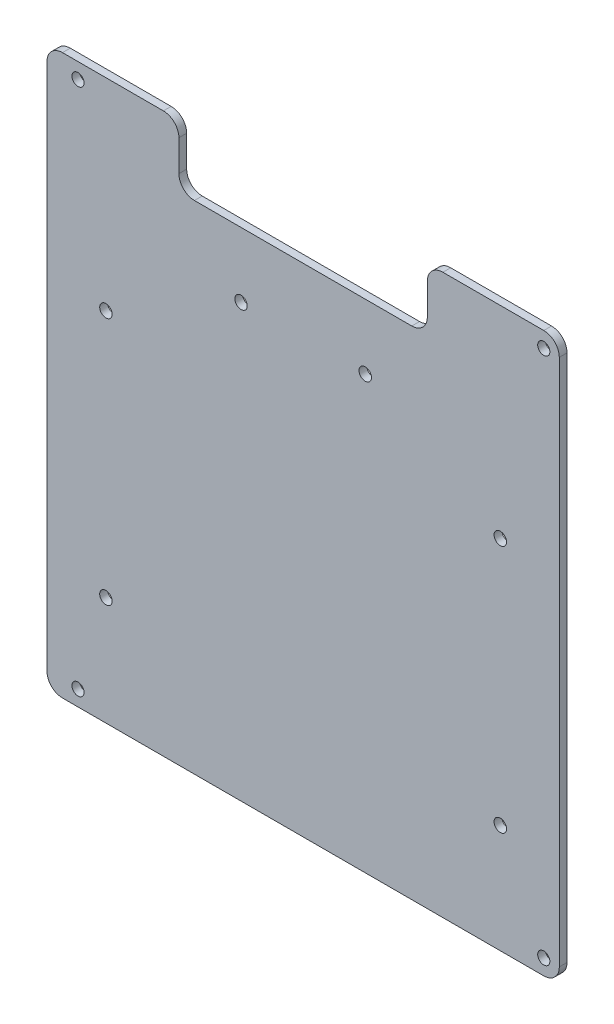
ISO-10303-21;
HEADER;
FILE_DESCRIPTION(('STEP AP214'),'2;1');
FILE_NAME('part.step','',(''),(''),'','','');
FILE_SCHEMA(('AUTOMOTIVE_DESIGN { 1 0 10303 214 1 1 1 1 }'));
ENDSEC;
DATA;
#1=APPLICATION_CONTEXT('core data for automotive mechanical design processes');
#2=APPLICATION_PROTOCOL_DEFINITION('international standard','automotive_design',2000,#1);
#3=PRODUCT_CONTEXT('',#1,'mechanical');
#4=PRODUCT('Part','Part','',(#3));
#5=PRODUCT_RELATED_PRODUCT_CATEGORY('part','',(#4));
#6=PRODUCT_DEFINITION_FORMATION('','',#4);
#7=PRODUCT_DEFINITION_CONTEXT('part definition',#1,'design');
#8=PRODUCT_DEFINITION('design','',#6,#7);
#9=PRODUCT_DEFINITION_SHAPE('','',#8);
#10=(LENGTH_UNIT() NAMED_UNIT(*) SI_UNIT(.MILLI.,.METRE.));
#11=(NAMED_UNIT(*) PLANE_ANGLE_UNIT() SI_UNIT($,.RADIAN.));
#12=(NAMED_UNIT(*) SI_UNIT($,.STERADIAN.) SOLID_ANGLE_UNIT());
#13=UNCERTAINTY_MEASURE_WITH_UNIT(LENGTH_MEASURE(1.E-05),#10,'distance_accuracy_value','');
#14=(GEOMETRIC_REPRESENTATION_CONTEXT(3) GLOBAL_UNCERTAINTY_ASSIGNED_CONTEXT((#13)) GLOBAL_UNIT_ASSIGNED_CONTEXT((#10,
#11,#12)) REPRESENTATION_CONTEXT('',''));
#15=CARTESIAN_POINT('',(0.,0.,0.));
#16=DIRECTION('',(0.,0.,1.));
#17=DIRECTION('',(1.,0.,0.));
#18=AXIS2_PLACEMENT_3D('',#15,#16,#17);
#19=CARTESIAN_POINT('',(-47.625,-107.95,149.225));
#20=DIRECTION('',(0.,-1.,0.));
#21=DIRECTION('',(0.,0.,-1.));
#22=AXIS2_PLACEMENT_3D('',#19,#20,#21);
#23=PLANE('',#22);
#24=DIRECTION('',(1.,0.,0.));
#25=VECTOR('',#24,1.);
#26=CARTESIAN_POINT('',(-47.625,-107.95,152.4));
#27=LINE('',#26,#25);
#28=CARTESIAN_POINT('',(-146.05,-107.95,152.4));
#29=VERTEX_POINT('',#28);
#30=CARTESIAN_POINT('',(-104.775,-107.95,152.4));
#31=VERTEX_POINT('',#30);
#32=EDGE_CURVE('E334',#29,#31,#27,.T.);
#33=ORIENTED_EDGE('',*,*,#32,.T.);
#34=DIRECTION('',(0.,0.,1.));
#35=VECTOR('',#34,1.);
#36=CARTESIAN_POINT('',(-104.775,-107.95,149.225));
#37=LINE('',#36,#35);
#38=CARTESIAN_POINT('',(-104.775,-107.95,149.225));
#39=VERTEX_POINT('',#38);
#40=EDGE_CURVE('E26',#31,#39,#37,.F.);
#41=ORIENTED_EDGE('',*,*,#40,.T.);
#42=DIRECTION('',(1.,0.,0.));
#43=VECTOR('',#42,1.);
#44=CARTESIAN_POINT('',(-47.625,-107.95,149.225));
#45=LINE('',#44,#43);
#46=CARTESIAN_POINT('',(-146.05,-107.95,149.225));
#47=VERTEX_POINT('',#46);
#48=EDGE_CURVE('E314',#47,#39,#45,.T.);
#49=ORIENTED_EDGE('',*,*,#48,.F.);
#50=DIRECTION('',(0.,0.,1.));
#51=VECTOR('',#50,1.);
#52=CARTESIAN_POINT('',(-146.05,-107.95,149.225));
#53=LINE('',#52,#51);
#54=EDGE_CURVE('E178',#47,#29,#53,.T.);
#55=ORIENTED_EDGE('',*,*,#54,.T.);
#56=EDGE_LOOP('',(#33,#41,#49,#55));
#57=FACE_BOUND('',#56,.T.);
#58=ADVANCED_FACE('F17',(#57),#23,.F.);
#59=CARTESIAN_POINT('',(0.,-219.075,149.225));
#60=DIRECTION('',(0.,0.,1.));
#61=DIRECTION('',(1.,0.,0.));
#62=AXIS2_PLACEMENT_3D('',#59,#60,#61);
#63=PLANE('',#62);
#64=CARTESIAN_POINT('',(-22.225,-159.893,149.225));
#65=DIRECTION('',(0.,0.,-1.));
#66=DIRECTION('',(-1.,0.,0.));
#67=AXIS2_PLACEMENT_3D('',#64,#65,#66);
#68=CIRCLE('',#67,2.5527);
#69=CARTESIAN_POINT('',(-24.7777,-159.893,149.225));
#70=VERTEX_POINT('',#69);
#71=EDGE_CURVE('E302',#70,#70,#68,.T.);
#72=ORIENTED_EDGE('',*,*,#71,.F.);
#73=EDGE_LOOP('',(#72));
#74=FACE_BOUND('',#73,.T.);
#75=CARTESIAN_POINT('',(-128.27,-190.5,149.225));
#76=DIRECTION('',(0.,0.,-1.));
#77=DIRECTION('',(-1.,0.,0.));
#78=AXIS2_PLACEMENT_3D('',#75,#76,#77);
#79=CIRCLE('',#78,2.5527);
#80=CARTESIAN_POINT('',(-130.8227,-190.5,149.225));
#81=VERTEX_POINT('',#80);
#82=EDGE_CURVE('E305',#81,#81,#79,.T.);
#83=ORIENTED_EDGE('',*,*,#82,.F.);
#84=EDGE_LOOP('',(#83));
#85=FACE_BOUND('',#84,.T.);
#86=CARTESIAN_POINT('',(-128.27,-292.1,149.225));
#87=DIRECTION('',(0.,0.,-1.));
#88=DIRECTION('',(-1.,0.,0.));
#89=AXIS2_PLACEMENT_3D('',#86,#87,#88);
#90=CIRCLE('',#89,2.5527);
#91=CARTESIAN_POINT('',(-130.8227,-292.1,149.225));
#92=VERTEX_POINT('',#91);
#93=EDGE_CURVE('E338',#92,#92,#90,.T.);
#94=ORIENTED_EDGE('',*,*,#93,.F.);
#95=EDGE_LOOP('',(#94));
#96=FACE_BOUND('',#95,.T.);
#97=CARTESIAN_POINT('',(33.02,-190.5,149.225));
#98=DIRECTION('',(0.,0.,-1.));
#99=DIRECTION('',(-1.,0.,0.));
#100=AXIS2_PLACEMENT_3D('',#97,#98,#99);
#101=CIRCLE('',#100,2.5527);
#102=CARTESIAN_POINT('',(30.4673,-190.5,149.225));
#103=VERTEX_POINT('',#102);
#104=EDGE_CURVE('E340',#103,#103,#101,.T.);
#105=ORIENTED_EDGE('',*,*,#104,.F.);
#106=EDGE_LOOP('',(#105));
#107=FACE_BOUND('',#106,.T.);
#108=CARTESIAN_POINT('',(33.02,-292.1,149.225));
#109=DIRECTION('',(0.,0.,-1.));
#110=DIRECTION('',(-1.,0.,0.));
#111=AXIS2_PLACEMENT_3D('',#108,#109,#110);
#112=CIRCLE('',#111,2.5527);
#113=CARTESIAN_POINT('',(30.4673,-292.1,149.225));
#114=VERTEX_POINT('',#113);
#115=EDGE_CURVE('E225',#114,#114,#112,.T.);
#116=ORIENTED_EDGE('',*,*,#115,.F.);
#117=EDGE_LOOP('',(#116));
#118=FACE_BOUND('',#117,.T.);
#119=ORIENTED_EDGE('',*,*,#48,.T.);
#120=CARTESIAN_POINT('',(-104.775,-114.3,149.225));
#121=DIRECTION('',(0.,0.,1.));
#122=DIRECTION('',(1.,0.,0.));
#123=AXIS2_PLACEMENT_3D('',#120,#121,#122);
#124=CIRCLE('',#123,6.35);
#125=CARTESIAN_POINT('',(-98.425,-114.3,149.225));
#126=VERTEX_POINT('',#125);
#127=EDGE_CURVE('E11',#39,#126,#124,.F.);
#128=ORIENTED_EDGE('',*,*,#127,.T.);
#129=DIRECTION('',(0.,-1.,0.));
#130=VECTOR('',#129,1.);
#131=CARTESIAN_POINT('',(-98.425,-219.075,149.225));
#132=LINE('',#131,#130);
#133=CARTESIAN_POINT('',(-98.425,-127.,149.225));
#134=VERTEX_POINT('',#133);
#135=EDGE_CURVE('E248',#126,#134,#132,.T.);
#136=ORIENTED_EDGE('',*,*,#135,.T.);
#137=CARTESIAN_POINT('',(-92.075,-127.,149.225));
#138=DIRECTION('',(0.,0.,1.));
#139=DIRECTION('',(1.,0.,0.));
#140=AXIS2_PLACEMENT_3D('',#137,#138,#139);
#141=CIRCLE('',#140,6.35);
#142=CARTESIAN_POINT('',(-92.075,-133.35,149.225));
#143=VERTEX_POINT('',#142);
#144=EDGE_CURVE('E278',#134,#143,#141,.T.);
#145=ORIENTED_EDGE('',*,*,#144,.T.);
#146=DIRECTION('',(1.,0.,0.));
#147=VECTOR('',#146,1.);
#148=CARTESIAN_POINT('',(0.,-133.35,149.225));
#149=LINE('',#148,#147);
#150=CARTESIAN_POINT('',(-3.17500000000014,-133.35,149.225));
#151=VERTEX_POINT('',#150);
#152=EDGE_CURVE('E323',#143,#151,#149,.T.);
#153=ORIENTED_EDGE('',*,*,#152,.T.);
#154=CARTESIAN_POINT('',(-3.17500000000014,-127.,149.225));
#155=DIRECTION('',(0.,0.,1.));
#156=DIRECTION('',(1.,0.,0.));
#157=AXIS2_PLACEMENT_3D('',#154,#155,#156);
#158=CIRCLE('',#157,6.35);
#159=CARTESIAN_POINT('',(3.17499999999986,-127.,149.225));
#160=VERTEX_POINT('',#159);
#161=EDGE_CURVE('E263',#151,#160,#158,.T.);
#162=ORIENTED_EDGE('',*,*,#161,.T.);
#163=DIRECTION('',(0.,-1.,0.));
#164=VECTOR('',#163,1.);
#165=CARTESIAN_POINT('',(3.17499999999985,-219.075,149.225));
#166=LINE('',#165,#164);
#167=CARTESIAN_POINT('',(3.17499999999986,-114.3,149.225));
#168=VERTEX_POINT('',#167);
#169=EDGE_CURVE('E219',#168,#160,#166,.T.);
#170=ORIENTED_EDGE('',*,*,#169,.F.);
#171=CARTESIAN_POINT('',(9.52499999999987,-114.3,149.225));
#172=DIRECTION('',(0.,0.,1.));
#173=DIRECTION('',(1.,0.,0.));
#174=AXIS2_PLACEMENT_3D('',#171,#172,#173);
#175=CIRCLE('',#174,6.35);
#176=CARTESIAN_POINT('',(9.52499999999987,-107.95,149.225));
#177=VERTEX_POINT('',#176);
#178=EDGE_CURVE('E291',#168,#177,#175,.F.);
#179=ORIENTED_EDGE('',*,*,#178,.T.);
#180=CARTESIAN_POINT('',(50.8,-107.95,149.225));
#181=VERTEX_POINT('',#180);
#182=EDGE_CURVE('E312',#177,#181,#45,.T.);
#183=ORIENTED_EDGE('',*,*,#182,.T.);
#184=CARTESIAN_POINT('',(50.8,-114.3,149.225));
#185=DIRECTION('',(0.,0.,1.));
#186=DIRECTION('',(1.,0.,0.));
#187=AXIS2_PLACEMENT_3D('',#184,#185,#186);
#188=CIRCLE('',#187,6.35);
#189=CARTESIAN_POINT('',(57.15,-114.3,149.225));
#190=VERTEX_POINT('',#189);
#191=EDGE_CURVE('E175',#181,#190,#188,.F.);
#192=ORIENTED_EDGE('',*,*,#191,.T.);
#193=DIRECTION('',(0.,1.,0.));
#194=VECTOR('',#193,1.);
#195=CARTESIAN_POINT('',(57.15,-222.25,149.225));
#196=LINE('',#195,#194);
#197=CARTESIAN_POINT('',(57.15,-330.2,149.225));
#198=VERTEX_POINT('',#197);
#199=EDGE_CURVE('E157',#198,#190,#196,.T.);
#200=ORIENTED_EDGE('',*,*,#199,.F.);
#201=CARTESIAN_POINT('',(50.8,-330.2,149.225));
#202=DIRECTION('',(0.,0.,1.));
#203=DIRECTION('',(1.,0.,0.));
#204=AXIS2_PLACEMENT_3D('',#201,#202,#203);
#205=CIRCLE('',#204,6.35);
#206=CARTESIAN_POINT('',(50.8,-336.55,149.225));
#207=VERTEX_POINT('',#206);
#208=EDGE_CURVE('E202',#198,#207,#205,.F.);
#209=ORIENTED_EDGE('',*,*,#208,.T.);
#210=DIRECTION('',(1.,0.,0.));
#211=VECTOR('',#210,1.);
#212=CARTESIAN_POINT('',(-47.625,-336.55,149.225));
#213=LINE('',#212,#211);
#214=CARTESIAN_POINT('',(-146.05,-336.55,149.225));
#215=VERTEX_POINT('',#214);
#216=EDGE_CURVE('E309',#215,#207,#213,.T.);
#217=ORIENTED_EDGE('',*,*,#216,.F.);
#218=CARTESIAN_POINT('',(-146.05,-330.2,149.225));
#219=DIRECTION('',(0.,0.,1.));
#220=DIRECTION('',(1.,0.,0.));
#221=AXIS2_PLACEMENT_3D('',#218,#219,#220);
#222=CIRCLE('',#221,6.35);
#223=CARTESIAN_POINT('',(-152.4,-330.2,149.225));
#224=VERTEX_POINT('',#223);
#225=EDGE_CURVE('E216',#215,#224,#222,.F.);
#226=ORIENTED_EDGE('',*,*,#225,.T.);
#227=DIRECTION('',(0.,1.,0.));
#228=VECTOR('',#227,1.);
#229=CARTESIAN_POINT('',(-152.4,-222.25,149.225));
#230=LINE('',#229,#228);
#231=CARTESIAN_POINT('',(-152.4,-114.3,149.225));
#232=VERTEX_POINT('',#231);
#233=EDGE_CURVE('E332',#224,#232,#230,.T.);
#234=ORIENTED_EDGE('',*,*,#233,.T.);
#235=CARTESIAN_POINT('',(-146.05,-114.3,149.225));
#236=DIRECTION('',(0.,0.,1.));
#237=DIRECTION('',(1.,0.,0.));
#238=AXIS2_PLACEMENT_3D('',#235,#236,#237);
#239=CIRCLE('',#238,6.35);
#240=EDGE_CURVE('E190',#232,#47,#239,.F.);
#241=ORIENTED_EDGE('',*,*,#240,.T.);
#242=EDGE_LOOP('',(#119,#128,#136,#145,#153,#162,#170,#179,#183,#192,#200,#209,#217,#226,#234,#241));
#243=FACE_BOUND('',#242,.T.);
#244=CARTESIAN_POINT('',(-139.7,-330.2,149.225));
#245=DIRECTION('',(0.,0.,1.));
#246=DIRECTION('',(1.,0.,0.));
#247=AXIS2_PLACEMENT_3D('',#244,#245,#246);
#248=CIRCLE('',#247,2.4892);
#249=CARTESIAN_POINT('',(-137.2108,-330.2,149.225));
#250=VERTEX_POINT('',#249);
#251=EDGE_CURVE('E308',#250,#250,#248,.T.);
#252=ORIENTED_EDGE('',*,*,#251,.T.);
#253=EDGE_LOOP('',(#252));
#254=FACE_BOUND('',#253,.T.);
#255=CARTESIAN_POINT('',(50.8,-330.2,149.225));
#256=DIRECTION('',(0.,0.,1.));
#257=DIRECTION('',(1.,0.,0.));
#258=AXIS2_PLACEMENT_3D('',#255,#256,#257);
#259=CIRCLE('',#258,2.4892);
#260=CARTESIAN_POINT('',(53.2892,-330.2,149.225));
#261=VERTEX_POINT('',#260);
#262=EDGE_CURVE('E315',#261,#261,#259,.T.);
#263=ORIENTED_EDGE('',*,*,#262,.T.);
#264=EDGE_LOOP('',(#263));
#265=FACE_BOUND('',#264,.T.);
#266=CARTESIAN_POINT('',(-139.7,-114.3,149.225));
#267=DIRECTION('',(0.,0.,1.));
#268=DIRECTION('',(1.,0.,0.));
#269=AXIS2_PLACEMENT_3D('',#266,#267,#268);
#270=CIRCLE('',#269,2.4892);
#271=CARTESIAN_POINT('',(-137.2108,-114.3,149.225));
#272=VERTEX_POINT('',#271);
#273=EDGE_CURVE('E167',#272,#272,#270,.T.);
#274=ORIENTED_EDGE('',*,*,#273,.T.);
#275=EDGE_LOOP('',(#274));
#276=FACE_BOUND('',#275,.T.);
#277=CARTESIAN_POINT('',(50.8,-114.3,149.225));
#278=DIRECTION('',(0.,0.,1.));
#279=DIRECTION('',(1.,0.,0.));
#280=AXIS2_PLACEMENT_3D('',#277,#278,#279);
#281=CIRCLE('',#280,2.4892);
#282=CARTESIAN_POINT('',(53.2892,-114.3,149.225));
#283=VERTEX_POINT('',#282);
#284=EDGE_CURVE('E160',#283,#283,#281,.T.);
#285=ORIENTED_EDGE('',*,*,#284,.T.);
#286=EDGE_LOOP('',(#285));
#287=FACE_BOUND('',#286,.T.);
#288=CARTESIAN_POINT('',(-73.025,-159.893,149.225));
#289=DIRECTION('',(0.,0.,1.));
#290=DIRECTION('',(-1.,0.,0.));
#291=AXIS2_PLACEMENT_3D('',#288,#289,#290);
#292=CIRCLE('',#291,2.5527);
#293=CARTESIAN_POINT('',(-75.5777,-159.893,149.225));
#294=VERTEX_POINT('',#293);
#295=EDGE_CURVE('E306',#294,#294,#292,.T.);
#296=ORIENTED_EDGE('',*,*,#295,.T.);
#297=EDGE_LOOP('',(#296));
#298=FACE_BOUND('',#297,.T.);
#299=ADVANCED_FACE('F391',(#74,#85,#96,#107,#118,#243,#254,#265,#276,#287,#298),#63,.F.);
#300=CARTESIAN_POINT('',(0.,-219.075,152.4));
#301=DIRECTION('',(0.,0.,1.));
#302=DIRECTION('',(1.,0.,0.));
#303=AXIS2_PLACEMENT_3D('',#300,#301,#302);
#304=PLANE('',#303);
#305=DIRECTION('',(0.,-1.,0.));
#306=VECTOR('',#305,1.);
#307=CARTESIAN_POINT('',(-98.425,-120.65,152.4));
#308=LINE('',#307,#306);
#309=CARTESIAN_POINT('',(-98.425,-114.3,152.4));
#310=VERTEX_POINT('',#309);
#311=CARTESIAN_POINT('',(-98.425,-127.,152.4));
#312=VERTEX_POINT('',#311);
#313=EDGE_CURVE('E354',#310,#312,#308,.T.);
#314=ORIENTED_EDGE('',*,*,#313,.F.);
#315=CARTESIAN_POINT('',(-104.775,-114.3,152.4));
#316=DIRECTION('',(0.,0.,1.));
#317=DIRECTION('',(1.,0.,0.));
#318=AXIS2_PLACEMENT_3D('',#315,#316,#317);
#319=CIRCLE('',#318,6.35);
#320=EDGE_CURVE('E40',#310,#31,#319,.T.);
#321=ORIENTED_EDGE('',*,*,#320,.T.);
#322=ORIENTED_EDGE('',*,*,#32,.F.);
#323=CARTESIAN_POINT('',(-146.05,-114.3,152.4));
#324=DIRECTION('',(0.,0.,1.));
#325=DIRECTION('',(1.,0.,0.));
#326=AXIS2_PLACEMENT_3D('',#323,#324,#325);
#327=CIRCLE('',#326,6.35);
#328=CARTESIAN_POINT('',(-152.4,-114.3,152.4));
#329=VERTEX_POINT('',#328);
#330=EDGE_CURVE('E182',#29,#329,#327,.T.);
#331=ORIENTED_EDGE('',*,*,#330,.T.);
#332=DIRECTION('',(0.,1.,0.));
#333=VECTOR('',#332,1.);
#334=CARTESIAN_POINT('',(-152.4,-222.25,152.4));
#335=LINE('',#334,#333);
#336=CARTESIAN_POINT('',(-152.4,-330.2,152.4));
#337=VERTEX_POINT('',#336);
#338=EDGE_CURVE('E245',#337,#329,#335,.T.);
#339=ORIENTED_EDGE('',*,*,#338,.F.);
#340=CARTESIAN_POINT('',(-146.05,-330.2,152.4));
#341=DIRECTION('',(0.,0.,1.));
#342=DIRECTION('',(1.,0.,0.));
#343=AXIS2_PLACEMENT_3D('',#340,#341,#342);
#344=CIRCLE('',#343,6.35);
#345=CARTESIAN_POINT('',(-146.05,-336.55,152.4));
#346=VERTEX_POINT('',#345);
#347=EDGE_CURVE('E210',#337,#346,#344,.T.);
#348=ORIENTED_EDGE('',*,*,#347,.T.);
#349=DIRECTION('',(1.,0.,0.));
#350=VECTOR('',#349,1.);
#351=CARTESIAN_POINT('',(-47.625,-336.55,152.4));
#352=LINE('',#351,#350);
#353=CARTESIAN_POINT('',(50.8,-336.55,152.4));
#354=VERTEX_POINT('',#353);
#355=EDGE_CURVE('E144',#346,#354,#352,.T.);
#356=ORIENTED_EDGE('',*,*,#355,.T.);
#357=CARTESIAN_POINT('',(50.8,-330.2,152.4));
#358=DIRECTION('',(0.,0.,1.));
#359=DIRECTION('',(1.,0.,0.));
#360=AXIS2_PLACEMENT_3D('',#357,#358,#359);
#361=CIRCLE('',#360,6.35);
#362=CARTESIAN_POINT('',(57.15,-330.2,152.4));
#363=VERTEX_POINT('',#362);
#364=EDGE_CURVE('E138',#354,#363,#361,.T.);
#365=ORIENTED_EDGE('',*,*,#364,.T.);
#366=DIRECTION('',(0.,1.,0.));
#367=VECTOR('',#366,1.);
#368=CARTESIAN_POINT('',(57.15,-222.25,152.4));
#369=LINE('',#368,#367);
#370=CARTESIAN_POINT('',(57.15,-114.3,152.4));
#371=VERTEX_POINT('',#370);
#372=EDGE_CURVE('E130',#363,#371,#369,.T.);
#373=ORIENTED_EDGE('',*,*,#372,.T.);
#374=CARTESIAN_POINT('',(50.8,-114.3,152.4));
#375=DIRECTION('',(0.,0.,1.));
#376=DIRECTION('',(1.,0.,0.));
#377=AXIS2_PLACEMENT_3D('',#374,#375,#376);
#378=CIRCLE('',#377,6.35);
#379=CARTESIAN_POINT('',(50.8,-107.95,152.4));
#380=VERTEX_POINT('',#379);
#381=EDGE_CURVE('E135',#371,#380,#378,.T.);
#382=ORIENTED_EDGE('',*,*,#381,.T.);
#383=CARTESIAN_POINT('',(9.52499999999987,-107.95,152.4));
#384=VERTEX_POINT('',#383);
#385=EDGE_CURVE('E328',#384,#380,#27,.T.);
#386=ORIENTED_EDGE('',*,*,#385,.F.);
#387=CARTESIAN_POINT('',(9.52499999999987,-114.3,152.4));
#388=DIRECTION('',(0.,0.,1.));
#389=DIRECTION('',(1.,0.,0.));
#390=AXIS2_PLACEMENT_3D('',#387,#388,#389);
#391=CIRCLE('',#390,6.35);
#392=CARTESIAN_POINT('',(3.17499999999986,-114.3,152.4));
#393=VERTEX_POINT('',#392);
#394=EDGE_CURVE('E285',#384,#393,#391,.T.);
#395=ORIENTED_EDGE('',*,*,#394,.T.);
#396=DIRECTION('',(0.,-1.,0.));
#397=VECTOR('',#396,1.);
#398=CARTESIAN_POINT('',(3.17499999999986,-120.65,152.4));
#399=LINE('',#398,#397);
#400=CARTESIAN_POINT('',(3.17499999999986,-127.,152.4));
#401=VERTEX_POINT('',#400);
#402=EDGE_CURVE('E350',#393,#401,#399,.T.);
#403=ORIENTED_EDGE('',*,*,#402,.T.);
#404=CARTESIAN_POINT('',(-3.17500000000014,-127.,152.4));
#405=DIRECTION('',(0.,0.,1.));
#406=DIRECTION('',(1.,0.,0.));
#407=AXIS2_PLACEMENT_3D('',#404,#405,#406);
#408=CIRCLE('',#407,6.35);
#409=CARTESIAN_POINT('',(-3.17500000000013,-133.35,152.4));
#410=VERTEX_POINT('',#409);
#411=EDGE_CURVE('E259',#401,#410,#408,.F.);
#412=ORIENTED_EDGE('',*,*,#411,.T.);
#413=DIRECTION('',(1.,0.,0.));
#414=VECTOR('',#413,1.);
#415=CARTESIAN_POINT('',(-47.625,-133.35,152.4));
#416=LINE('',#415,#414);
#417=CARTESIAN_POINT('',(-92.075,-133.35,152.4));
#418=VERTEX_POINT('',#417);
#419=EDGE_CURVE('E351',#418,#410,#416,.T.);
#420=ORIENTED_EDGE('',*,*,#419,.F.);
#421=CARTESIAN_POINT('',(-92.075,-127.,152.4));
#422=DIRECTION('',(0.,0.,1.));
#423=DIRECTION('',(1.,0.,0.));
#424=AXIS2_PLACEMENT_3D('',#421,#422,#423);
#425=CIRCLE('',#424,6.35);
#426=EDGE_CURVE('E275',#418,#312,#425,.F.);
#427=ORIENTED_EDGE('',*,*,#426,.T.);
#428=EDGE_LOOP('',(#314,#321,#322,#331,#339,#348,#356,#365,#373,#382,#386,#395,#403,#412,#420,#427));
#429=FACE_BOUND('',#428,.T.);
#430=CARTESIAN_POINT('',(-22.225,-159.893,152.4));
#431=DIRECTION('',(0.,0.,1.));
#432=DIRECTION('',(1.,0.,0.));
#433=AXIS2_PLACEMENT_3D('',#430,#431,#432);
#434=CIRCLE('',#433,2.5527);
#435=CARTESIAN_POINT('',(-19.6723,-159.893,152.4));
#436=VERTEX_POINT('',#435);
#437=EDGE_CURVE('E241',#436,#436,#434,.T.);
#438=ORIENTED_EDGE('',*,*,#437,.F.);
#439=EDGE_LOOP('',(#438));
#440=FACE_BOUND('',#439,.T.);
#441=CARTESIAN_POINT('',(-128.27,-190.5,152.4));
#442=DIRECTION('',(0.,0.,1.));
#443=DIRECTION('',(1.,0.,0.));
#444=AXIS2_PLACEMENT_3D('',#441,#442,#443);
#445=CIRCLE('',#444,2.5527);
#446=CARTESIAN_POINT('',(-125.7173,-190.5,152.4));
#447=VERTEX_POINT('',#446);
#448=EDGE_CURVE('E237',#447,#447,#445,.T.);
#449=ORIENTED_EDGE('',*,*,#448,.F.);
#450=EDGE_LOOP('',(#449));
#451=FACE_BOUND('',#450,.T.);
#452=CARTESIAN_POINT('',(-128.27,-292.1,152.4));
#453=DIRECTION('',(0.,0.,1.));
#454=DIRECTION('',(1.,0.,0.));
#455=AXIS2_PLACEMENT_3D('',#452,#453,#454);
#456=CIRCLE('',#455,2.5527);
#457=CARTESIAN_POINT('',(-125.7173,-292.1,152.4));
#458=VERTEX_POINT('',#457);
#459=EDGE_CURVE('E233',#458,#458,#456,.T.);
#460=ORIENTED_EDGE('',*,*,#459,.F.);
#461=EDGE_LOOP('',(#460));
#462=FACE_BOUND('',#461,.T.);
#463=CARTESIAN_POINT('',(33.02,-190.5,152.4));
#464=DIRECTION('',(0.,0.,1.));
#465=DIRECTION('',(1.,0.,0.));
#466=AXIS2_PLACEMENT_3D('',#463,#464,#465);
#467=CIRCLE('',#466,2.5527);
#468=CARTESIAN_POINT('',(35.5727,-190.5,152.4));
#469=VERTEX_POINT('',#468);
#470=EDGE_CURVE('E229',#469,#469,#467,.T.);
#471=ORIENTED_EDGE('',*,*,#470,.F.);
#472=EDGE_LOOP('',(#471));
#473=FACE_BOUND('',#472,.T.);
#474=CARTESIAN_POINT('',(50.8,-114.3,152.4));
#475=DIRECTION('',(0.,0.,1.));
#476=DIRECTION('',(1.,0.,0.));
#477=AXIS2_PLACEMENT_3D('',#474,#475,#476);
#478=CIRCLE('',#477,2.4892);
#479=CARTESIAN_POINT('',(53.2892,-114.3,152.4));
#480=VERTEX_POINT('',#479);
#481=EDGE_CURVE('E170',#480,#480,#478,.T.);
#482=ORIENTED_EDGE('',*,*,#481,.F.);
#483=EDGE_LOOP('',(#482));
#484=FACE_BOUND('',#483,.T.);
#485=CARTESIAN_POINT('',(-139.7,-114.3,152.4));
#486=DIRECTION('',(0.,0.,1.));
#487=DIRECTION('',(1.,0.,0.));
#488=AXIS2_PLACEMENT_3D('',#485,#486,#487);
#489=CIRCLE('',#488,2.4892);
#490=CARTESIAN_POINT('',(-137.2108,-114.3,152.4));
#491=VERTEX_POINT('',#490);
#492=EDGE_CURVE('E377',#491,#491,#489,.T.);
#493=ORIENTED_EDGE('',*,*,#492,.F.);
#494=EDGE_LOOP('',(#493));
#495=FACE_BOUND('',#494,.T.);
#496=CARTESIAN_POINT('',(50.8,-330.2,152.4));
#497=DIRECTION('',(0.,0.,1.));
#498=DIRECTION('',(1.,0.,0.));
#499=AXIS2_PLACEMENT_3D('',#496,#497,#498);
#500=CIRCLE('',#499,2.4892);
#501=CARTESIAN_POINT('',(53.2892,-330.2,152.4));
#502=VERTEX_POINT('',#501);
#503=EDGE_CURVE('E326',#502,#502,#500,.T.);
#504=ORIENTED_EDGE('',*,*,#503,.F.);
#505=EDGE_LOOP('',(#504));
#506=FACE_BOUND('',#505,.T.);
#507=CARTESIAN_POINT('',(-139.7,-330.2,152.4));
#508=DIRECTION('',(0.,0.,1.));
#509=DIRECTION('',(1.,0.,0.));
#510=AXIS2_PLACEMENT_3D('',#507,#508,#509);
#511=CIRCLE('',#510,2.4892);
#512=CARTESIAN_POINT('',(-137.2108,-330.2,152.4));
#513=VERTEX_POINT('',#512);
#514=EDGE_CURVE('E143',#513,#513,#511,.T.);
#515=ORIENTED_EDGE('',*,*,#514,.F.);
#516=EDGE_LOOP('',(#515));
#517=FACE_BOUND('',#516,.T.);
#518=CARTESIAN_POINT('',(33.02,-292.1,152.4));
#519=DIRECTION('',(0.,0.,1.));
#520=DIRECTION('',(1.,0.,0.));
#521=AXIS2_PLACEMENT_3D('',#518,#519,#520);
#522=CIRCLE('',#521,2.5527);
#523=CARTESIAN_POINT('',(35.5727,-292.1,152.4));
#524=VERTEX_POINT('',#523);
#525=EDGE_CURVE('E220',#524,#524,#522,.T.);
#526=ORIENTED_EDGE('',*,*,#525,.F.);
#527=EDGE_LOOP('',(#526));
#528=FACE_BOUND('',#527,.T.);
#529=CARTESIAN_POINT('',(-73.025,-159.893,152.4));
#530=DIRECTION('',(0.,0.,1.));
#531=DIRECTION('',(1.,0.,0.));
#532=AXIS2_PLACEMENT_3D('',#529,#530,#531);
#533=CIRCLE('',#532,2.5527);
#534=CARTESIAN_POINT('',(-70.4723,-159.893,152.4));
#535=VERTEX_POINT('',#534);
#536=EDGE_CURVE('E224',#535,#535,#533,.F.);
#537=ORIENTED_EDGE('',*,*,#536,.T.);
#538=EDGE_LOOP('',(#537));
#539=FACE_BOUND('',#538,.T.);
#540=ADVANCED_FACE('F132',(#429,#440,#451,#462,#473,#484,#495,#506,#517,#528,#539),#304,.T.);
#541=CARTESIAN_POINT('',(-152.4,-222.25,149.225));
#542=DIRECTION('',(1.,0.,0.));
#543=DIRECTION('',(0.,1.,0.));
#544=AXIS2_PLACEMENT_3D('',#541,#542,#543);
#545=PLANE('',#544);
#546=ORIENTED_EDGE('',*,*,#233,.F.);
#547=DIRECTION('',(0.,0.,1.));
#548=VECTOR('',#547,1.);
#549=CARTESIAN_POINT('',(-152.4,-330.2,152.4));
#550=LINE('',#549,#548);
#551=EDGE_CURVE('E206',#224,#337,#550,.T.);
#552=ORIENTED_EDGE('',*,*,#551,.T.);
#553=ORIENTED_EDGE('',*,*,#338,.T.);
#554=DIRECTION('',(0.,0.,1.));
#555=VECTOR('',#554,1.);
#556=CARTESIAN_POINT('',(-152.4,-114.3,149.225));
#557=LINE('',#556,#555);
#558=EDGE_CURVE('E186',#329,#232,#557,.F.);
#559=ORIENTED_EDGE('',*,*,#558,.T.);
#560=EDGE_LOOP('',(#546,#552,#553,#559));
#561=FACE_BOUND('',#560,.T.);
#562=ADVANCED_FACE('F390',(#561),#545,.F.);
#563=CARTESIAN_POINT('',(-47.625,-336.55,149.225));
#564=DIRECTION('',(0.,-1.,0.));
#565=DIRECTION('',(0.,0.,-1.));
#566=AXIS2_PLACEMENT_3D('',#563,#564,#565);
#567=PLANE('',#566);
#568=ORIENTED_EDGE('',*,*,#355,.F.);
#569=DIRECTION('',(0.,0.,1.));
#570=VECTOR('',#569,1.);
#571=CARTESIAN_POINT('',(-146.05,-336.55,149.225));
#572=LINE('',#571,#570);
#573=EDGE_CURVE('E213',#346,#215,#572,.F.);
#574=ORIENTED_EDGE('',*,*,#573,.T.);
#575=ORIENTED_EDGE('',*,*,#216,.T.);
#576=DIRECTION('',(0.,0.,1.));
#577=VECTOR('',#576,1.);
#578=CARTESIAN_POINT('',(50.8,-336.55,149.225));
#579=LINE('',#578,#577);
#580=EDGE_CURVE('E193',#207,#354,#579,.T.);
#581=ORIENTED_EDGE('',*,*,#580,.T.);
#582=EDGE_LOOP('',(#568,#574,#575,#581));
#583=FACE_BOUND('',#582,.T.);
#584=ADVANCED_FACE('F442',(#583),#567,.T.);
#585=CARTESIAN_POINT('',(57.15,-222.25,149.225));
#586=DIRECTION('',(1.,0.,0.));
#587=DIRECTION('',(0.,1.,0.));
#588=AXIS2_PLACEMENT_3D('',#585,#586,#587);
#589=PLANE('',#588);
#590=ORIENTED_EDGE('',*,*,#372,.F.);
#591=DIRECTION('',(0.,0.,1.));
#592=VECTOR('',#591,1.);
#593=CARTESIAN_POINT('',(57.15,-330.2,149.225));
#594=LINE('',#593,#592);
#595=EDGE_CURVE('E199',#363,#198,#594,.F.);
#596=ORIENTED_EDGE('',*,*,#595,.T.);
#597=ORIENTED_EDGE('',*,*,#199,.T.);
#598=DIRECTION('',(0.,0.,1.));
#599=VECTOR('',#598,1.);
#600=CARTESIAN_POINT('',(57.15,-114.3,152.4));
#601=LINE('',#600,#599);
#602=EDGE_CURVE('E150',#190,#371,#601,.T.);
#603=ORIENTED_EDGE('',*,*,#602,.T.);
#604=EDGE_LOOP('',(#590,#596,#597,#603));
#605=FACE_BOUND('',#604,.T.);
#606=ADVANCED_FACE('F155',(#605),#589,.T.);
#607=CARTESIAN_POINT('',(-139.7,-114.3,149.225));
#608=DIRECTION('',(0.,0.,1.));
#609=DIRECTION('',(1.,0.,0.));
#610=AXIS2_PLACEMENT_3D('',#607,#608,#609);
#611=CYLINDRICAL_SURFACE('',#610,2.4892);
#612=ORIENTED_EDGE('',*,*,#273,.F.);
#613=EDGE_LOOP('',(#612));
#614=FACE_BOUND('',#613,.T.);
#615=ORIENTED_EDGE('',*,*,#492,.T.);
#616=EDGE_LOOP('',(#615));
#617=FACE_BOUND('',#616,.T.);
#618=ADVANCED_FACE('F426',(#614,#617),#611,.F.);
#619=CARTESIAN_POINT('',(50.8,-330.2,149.225));
#620=DIRECTION('',(0.,0.,1.));
#621=DIRECTION('',(1.,0.,0.));
#622=AXIS2_PLACEMENT_3D('',#619,#620,#621);
#623=CYLINDRICAL_SURFACE('',#622,2.4892);
#624=ORIENTED_EDGE('',*,*,#262,.F.);
#625=EDGE_LOOP('',(#624));
#626=FACE_BOUND('',#625,.T.);
#627=ORIENTED_EDGE('',*,*,#503,.T.);
#628=EDGE_LOOP('',(#627));
#629=FACE_BOUND('',#628,.T.);
#630=ADVANCED_FACE('F428',(#626,#629),#623,.F.);
#631=CARTESIAN_POINT('',(-139.7,-330.2,149.225));
#632=DIRECTION('',(0.,0.,1.));
#633=DIRECTION('',(1.,0.,0.));
#634=AXIS2_PLACEMENT_3D('',#631,#632,#633);
#635=CYLINDRICAL_SURFACE('',#634,2.4892);
#636=ORIENTED_EDGE('',*,*,#251,.F.);
#637=EDGE_LOOP('',(#636));
#638=FACE_BOUND('',#637,.T.);
#639=ORIENTED_EDGE('',*,*,#514,.T.);
#640=EDGE_LOOP('',(#639));
#641=FACE_BOUND('',#640,.T.);
#642=ADVANCED_FACE('F432',(#638,#641),#635,.F.);
#643=ORIENTED_EDGE('',*,*,#182,.F.);
#644=DIRECTION('',(0.,0.,1.));
#645=VECTOR('',#644,1.);
#646=CARTESIAN_POINT('',(9.52499999999987,-107.95,152.4));
#647=LINE('',#646,#645);
#648=EDGE_CURVE('E281',#177,#384,#647,.T.);
#649=ORIENTED_EDGE('',*,*,#648,.T.);
#650=ORIENTED_EDGE('',*,*,#385,.T.);
#651=DIRECTION('',(0.,0.,1.));
#652=VECTOR('',#651,1.);
#653=CARTESIAN_POINT('',(50.8,-107.95,149.225));
#654=LINE('',#653,#652);
#655=EDGE_CURVE('E152',#380,#181,#654,.F.);
#656=ORIENTED_EDGE('',*,*,#655,.T.);
#657=EDGE_LOOP('',(#643,#649,#650,#656));
#658=FACE_BOUND('',#657,.T.);
#659=ADVANCED_FACE('F417',(#658),#23,.F.);
#660=CARTESIAN_POINT('',(50.8,-114.3,149.225));
#661=DIRECTION('',(0.,0.,1.));
#662=DIRECTION('',(1.,0.,0.));
#663=AXIS2_PLACEMENT_3D('',#660,#661,#662);
#664=CYLINDRICAL_SURFACE('',#663,2.4892);
#665=ORIENTED_EDGE('',*,*,#284,.F.);
#666=EDGE_LOOP('',(#665));
#667=FACE_BOUND('',#666,.T.);
#668=ORIENTED_EDGE('',*,*,#481,.T.);
#669=EDGE_LOOP('',(#668));
#670=FACE_BOUND('',#669,.T.);
#671=ADVANCED_FACE('F386',(#667,#670),#664,.F.);
#672=CARTESIAN_POINT('',(50.8,-114.3,149.225));
#673=DIRECTION('',(0.,0.,-1.));
#674=DIRECTION('',(-1.,0.,0.));
#675=AXIS2_PLACEMENT_3D('',#672,#673,#674);
#676=CYLINDRICAL_SURFACE('',#675,6.35);
#677=ORIENTED_EDGE('',*,*,#191,.F.);
#678=ORIENTED_EDGE('',*,*,#655,.F.);
#679=ORIENTED_EDGE('',*,*,#381,.F.);
#680=ORIENTED_EDGE('',*,*,#602,.F.);
#681=EDGE_LOOP('',(#677,#678,#679,#680));
#682=FACE_BOUND('',#681,.T.);
#683=ADVANCED_FACE('F149',(#682),#676,.T.);
#684=CARTESIAN_POINT('',(-146.05,-114.3,149.225));
#685=DIRECTION('',(0.,0.,1.));
#686=DIRECTION('',(1.,0.,0.));
#687=AXIS2_PLACEMENT_3D('',#684,#685,#686);
#688=CYLINDRICAL_SURFACE('',#687,6.35);
#689=ORIENTED_EDGE('',*,*,#240,.F.);
#690=ORIENTED_EDGE('',*,*,#558,.F.);
#691=ORIENTED_EDGE('',*,*,#330,.F.);
#692=ORIENTED_EDGE('',*,*,#54,.F.);
#693=EDGE_LOOP('',(#689,#690,#691,#692));
#694=FACE_BOUND('',#693,.T.);
#695=ADVANCED_FACE('F451',(#694),#688,.T.);
#696=CARTESIAN_POINT('',(50.8,-330.2,149.225));
#697=DIRECTION('',(0.,0.,1.));
#698=DIRECTION('',(1.,0.,0.));
#699=AXIS2_PLACEMENT_3D('',#696,#697,#698);
#700=CYLINDRICAL_SURFACE('',#699,6.35);
#701=ORIENTED_EDGE('',*,*,#208,.F.);
#702=ORIENTED_EDGE('',*,*,#595,.F.);
#703=ORIENTED_EDGE('',*,*,#364,.F.);
#704=ORIENTED_EDGE('',*,*,#580,.F.);
#705=EDGE_LOOP('',(#701,#702,#703,#704));
#706=FACE_BOUND('',#705,.T.);
#707=ADVANCED_FACE('F454',(#706),#700,.T.);
#708=CARTESIAN_POINT('',(-146.05,-330.2,149.225));
#709=DIRECTION('',(0.,0.,-1.));
#710=DIRECTION('',(-1.,0.,0.));
#711=AXIS2_PLACEMENT_3D('',#708,#709,#710);
#712=CYLINDRICAL_SURFACE('',#711,6.35);
#713=ORIENTED_EDGE('',*,*,#225,.F.);
#714=ORIENTED_EDGE('',*,*,#573,.F.);
#715=ORIENTED_EDGE('',*,*,#347,.F.);
#716=ORIENTED_EDGE('',*,*,#551,.F.);
#717=EDGE_LOOP('',(#713,#714,#715,#716));
#718=FACE_BOUND('',#717,.T.);
#719=ADVANCED_FACE('F458',(#718),#712,.T.);
#720=CARTESIAN_POINT('',(33.02,-292.1,174.625));
#721=DIRECTION('',(0.,0.,-1.));
#722=DIRECTION('',(-1.,0.,0.));
#723=AXIS2_PLACEMENT_3D('',#720,#721,#722);
#724=CYLINDRICAL_SURFACE('',#723,2.5527);
#725=ORIENTED_EDGE('',*,*,#525,.T.);
#726=EDGE_LOOP('',(#725));
#727=FACE_BOUND('',#726,.T.);
#728=ORIENTED_EDGE('',*,*,#115,.T.);
#729=EDGE_LOOP('',(#728));
#730=FACE_BOUND('',#729,.T.);
#731=ADVANCED_FACE('F406',(#727,#730),#724,.F.);
#732=CARTESIAN_POINT('',(-73.025,-159.893,174.625));
#733=DIRECTION('',(0.,0.,-1.));
#734=DIRECTION('',(-1.,0.,0.));
#735=AXIS2_PLACEMENT_3D('',#732,#733,#734);
#736=CYLINDRICAL_SURFACE('',#735,2.5527);
#737=ORIENTED_EDGE('',*,*,#536,.F.);
#738=EDGE_LOOP('',(#737));
#739=FACE_BOUND('',#738,.T.);
#740=ORIENTED_EDGE('',*,*,#295,.F.);
#741=EDGE_LOOP('',(#740));
#742=FACE_BOUND('',#741,.T.);
#743=ADVANCED_FACE('F402',(#739,#742),#736,.F.);
#744=CARTESIAN_POINT('',(33.02,-190.5,174.625));
#745=DIRECTION('',(0.,0.,-1.));
#746=DIRECTION('',(-1.,0.,0.));
#747=AXIS2_PLACEMENT_3D('',#744,#745,#746);
#748=CYLINDRICAL_SURFACE('',#747,2.5527);
#749=ORIENTED_EDGE('',*,*,#470,.T.);
#750=EDGE_LOOP('',(#749));
#751=FACE_BOUND('',#750,.T.);
#752=ORIENTED_EDGE('',*,*,#104,.T.);
#753=EDGE_LOOP('',(#752));
#754=FACE_BOUND('',#753,.T.);
#755=ADVANCED_FACE('F405',(#751,#754),#748,.F.);
#756=CARTESIAN_POINT('',(-128.27,-292.1,174.625));
#757=DIRECTION('',(0.,0.,-1.));
#758=DIRECTION('',(-1.,0.,0.));
#759=AXIS2_PLACEMENT_3D('',#756,#757,#758);
#760=CYLINDRICAL_SURFACE('',#759,2.5527);
#761=ORIENTED_EDGE('',*,*,#459,.T.);
#762=EDGE_LOOP('',(#761));
#763=FACE_BOUND('',#762,.T.);
#764=ORIENTED_EDGE('',*,*,#93,.T.);
#765=EDGE_LOOP('',(#764));
#766=FACE_BOUND('',#765,.T.);
#767=ADVANCED_FACE('F525',(#763,#766),#760,.F.);
#768=CARTESIAN_POINT('',(-128.27,-190.5,174.625));
#769=DIRECTION('',(0.,0.,-1.));
#770=DIRECTION('',(-1.,0.,0.));
#771=AXIS2_PLACEMENT_3D('',#768,#769,#770);
#772=CYLINDRICAL_SURFACE('',#771,2.5527);
#773=ORIENTED_EDGE('',*,*,#448,.T.);
#774=EDGE_LOOP('',(#773));
#775=FACE_BOUND('',#774,.T.);
#776=ORIENTED_EDGE('',*,*,#82,.T.);
#777=EDGE_LOOP('',(#776));
#778=FACE_BOUND('',#777,.T.);
#779=ADVANCED_FACE('F522',(#775,#778),#772,.F.);
#780=CARTESIAN_POINT('',(-22.225,-159.893,174.625));
#781=DIRECTION('',(0.,0.,-1.));
#782=DIRECTION('',(-1.,0.,0.));
#783=AXIS2_PLACEMENT_3D('',#780,#781,#782);
#784=CYLINDRICAL_SURFACE('',#783,2.5527);
#785=ORIENTED_EDGE('',*,*,#437,.T.);
#786=EDGE_LOOP('',(#785));
#787=FACE_BOUND('',#786,.T.);
#788=ORIENTED_EDGE('',*,*,#71,.T.);
#789=EDGE_LOOP('',(#788));
#790=FACE_BOUND('',#789,.T.);
#791=ADVANCED_FACE('F519',(#787,#790),#784,.F.);
#792=CARTESIAN_POINT('',(-98.425,-120.65,127.));
#793=DIRECTION('',(-1.,0.,0.));
#794=DIRECTION('',(0.,0.,1.));
#795=AXIS2_PLACEMENT_3D('',#792,#793,#794);
#796=PLANE('',#795);
#797=ORIENTED_EDGE('',*,*,#135,.F.);
#798=DIRECTION('',(0.,0.,1.));
#799=VECTOR('',#798,1.);
#800=CARTESIAN_POINT('',(-98.425,-114.3,127.));
#801=LINE('',#800,#799);
#802=EDGE_CURVE('E294',#126,#310,#801,.T.);
#803=ORIENTED_EDGE('',*,*,#802,.T.);
#804=ORIENTED_EDGE('',*,*,#313,.T.);
#805=DIRECTION('',(0.,0.,1.));
#806=VECTOR('',#805,1.);
#807=CARTESIAN_POINT('',(-98.425,-127.,149.225));
#808=LINE('',#807,#806);
#809=EDGE_CURVE('E271',#312,#134,#808,.F.);
#810=ORIENTED_EDGE('',*,*,#809,.T.);
#811=EDGE_LOOP('',(#797,#803,#804,#810));
#812=FACE_BOUND('',#811,.T.);
#813=ADVANCED_FACE('F499',(#812),#796,.F.);
#814=CARTESIAN_POINT('',(3.17499999999986,-120.65,127.));
#815=DIRECTION('',(-1.,0.,0.));
#816=DIRECTION('',(0.,-1.,0.));
#817=AXIS2_PLACEMENT_3D('',#814,#815,#816);
#818=PLANE('',#817);
#819=ORIENTED_EDGE('',*,*,#402,.F.);
#820=DIRECTION('',(0.,0.,1.));
#821=VECTOR('',#820,1.);
#822=CARTESIAN_POINT('',(3.17499999999986,-114.3,149.225));
#823=LINE('',#822,#821);
#824=EDGE_CURVE('E288',#393,#168,#823,.F.);
#825=ORIENTED_EDGE('',*,*,#824,.T.);
#826=ORIENTED_EDGE('',*,*,#169,.T.);
#827=DIRECTION('',(0.,0.,1.));
#828=VECTOR('',#827,1.);
#829=CARTESIAN_POINT('',(3.17499999999986,-127.,127.));
#830=LINE('',#829,#828);
#831=EDGE_CURVE('E251',#160,#401,#830,.T.);
#832=ORIENTED_EDGE('',*,*,#831,.T.);
#833=EDGE_LOOP('',(#819,#825,#826,#832));
#834=FACE_BOUND('',#833,.T.);
#835=ADVANCED_FACE('F512',(#834),#818,.T.);
#836=CARTESIAN_POINT('',(-47.625,-133.35,127.));
#837=DIRECTION('',(0.,-1.,0.));
#838=DIRECTION('',(0.,0.,-1.));
#839=AXIS2_PLACEMENT_3D('',#836,#837,#838);
#840=PLANE('',#839);
#841=ORIENTED_EDGE('',*,*,#152,.F.);
#842=DIRECTION('',(0.,0.,1.));
#843=VECTOR('',#842,1.);
#844=CARTESIAN_POINT('',(-92.075,-133.35,152.4));
#845=LINE('',#844,#843);
#846=EDGE_CURVE('E267',#143,#418,#845,.T.);
#847=ORIENTED_EDGE('',*,*,#846,.T.);
#848=ORIENTED_EDGE('',*,*,#419,.T.);
#849=DIRECTION('',(0.,0.,1.));
#850=VECTOR('',#849,1.);
#851=CARTESIAN_POINT('',(-3.17500000000013,-133.35,127.));
#852=LINE('',#851,#850);
#853=EDGE_CURVE('E255',#410,#151,#852,.F.);
#854=ORIENTED_EDGE('',*,*,#853,.T.);
#855=EDGE_LOOP('',(#841,#847,#848,#854));
#856=FACE_BOUND('',#855,.T.);
#857=ADVANCED_FACE('F467',(#856),#840,.F.);
#858=CARTESIAN_POINT('',(-3.17500000000014,-127.,127.));
#859=DIRECTION('',(0.,0.,1.));
#860=DIRECTION('',(1.,0.,0.));
#861=AXIS2_PLACEMENT_3D('',#858,#859,#860);
#862=CYLINDRICAL_SURFACE('',#861,6.35);
#863=ORIENTED_EDGE('',*,*,#161,.F.);
#864=ORIENTED_EDGE('',*,*,#853,.F.);
#865=ORIENTED_EDGE('',*,*,#411,.F.);
#866=ORIENTED_EDGE('',*,*,#831,.F.);
#867=EDGE_LOOP('',(#863,#864,#865,#866));
#868=FACE_BOUND('',#867,.T.);
#869=ADVANCED_FACE('F463',(#868),#862,.F.);
#870=CARTESIAN_POINT('',(-92.075,-127.,127.));
#871=DIRECTION('',(0.,0.,-1.));
#872=DIRECTION('',(-1.,0.,0.));
#873=AXIS2_PLACEMENT_3D('',#870,#871,#872);
#874=CYLINDRICAL_SURFACE('',#873,6.35);
#875=ORIENTED_EDGE('',*,*,#144,.F.);
#876=ORIENTED_EDGE('',*,*,#809,.F.);
#877=ORIENTED_EDGE('',*,*,#426,.F.);
#878=ORIENTED_EDGE('',*,*,#846,.F.);
#879=EDGE_LOOP('',(#875,#876,#877,#878));
#880=FACE_BOUND('',#879,.T.);
#881=ADVANCED_FACE('F466',(#880),#874,.F.);
#882=CARTESIAN_POINT('',(9.52499999999987,-114.3,149.225));
#883=DIRECTION('',(0.,0.,-1.));
#884=DIRECTION('',(-1.,0.,0.));
#885=AXIS2_PLACEMENT_3D('',#882,#883,#884);
#886=CYLINDRICAL_SURFACE('',#885,6.35);
#887=ORIENTED_EDGE('',*,*,#178,.F.);
#888=ORIENTED_EDGE('',*,*,#824,.F.);
#889=ORIENTED_EDGE('',*,*,#394,.F.);
#890=ORIENTED_EDGE('',*,*,#648,.F.);
#891=EDGE_LOOP('',(#887,#888,#889,#890));
#892=FACE_BOUND('',#891,.T.);
#893=ADVANCED_FACE('F470',(#892),#886,.T.);
#894=CARTESIAN_POINT('',(-104.775,-114.3,127.));
#895=DIRECTION('',(0.,0.,1.));
#896=DIRECTION('',(1.,0.,0.));
#897=AXIS2_PLACEMENT_3D('',#894,#895,#896);
#898=CYLINDRICAL_SURFACE('',#897,6.35);
#899=ORIENTED_EDGE('',*,*,#127,.F.);
#900=ORIENTED_EDGE('',*,*,#40,.F.);
#901=ORIENTED_EDGE('',*,*,#320,.F.);
#902=ORIENTED_EDGE('',*,*,#802,.F.);
#903=EDGE_LOOP('',(#899,#900,#901,#902));
#904=FACE_BOUND('',#903,.T.);
#905=ADVANCED_FACE('F19',(#904),#898,.T.);
#906=CLOSED_SHELL('',(#58,#299,#540,#562,#584,#606,#618,#630,#642,#659,#671,#683,#695,#707,#719,
#731,#743,#755,#767,#779,#791,#813,#835,#857,#869,#881,#893,#905));
#907=MANIFOLD_SOLID_BREP('B1',#906);
#908=ADVANCED_BREP_SHAPE_REPRESENTATION('',(#18,#907),#14);
#909=SHAPE_DEFINITION_REPRESENTATION(#9,#908);
ENDSEC;
END-ISO-10303-21;
